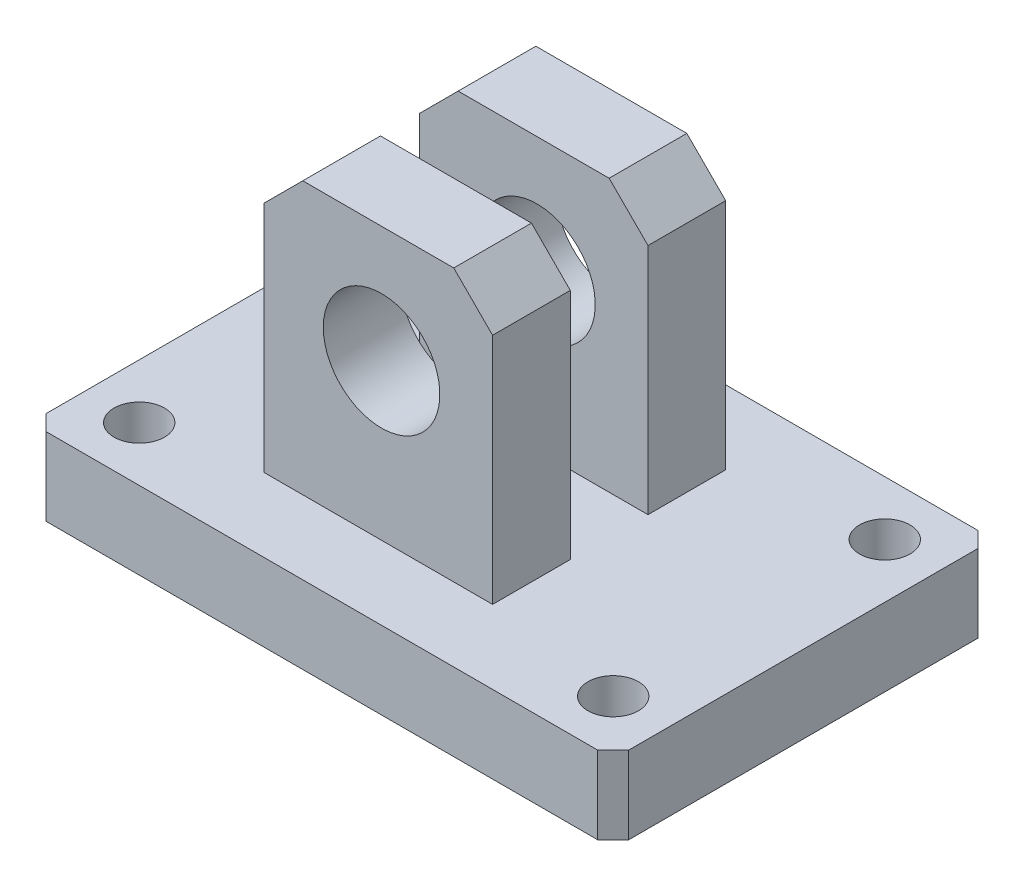
ISO-10303-21;
HEADER;
FILE_DESCRIPTION(('STEP AP214'),'2;1');
FILE_NAME('part.step','',(''),(''),'','','');
FILE_SCHEMA(('AUTOMOTIVE_DESIGN { 1 0 10303 214 1 1 1 1 }'));
ENDSEC;
DATA;
#1=APPLICATION_CONTEXT('core data for automotive mechanical design processes');
#2=APPLICATION_PROTOCOL_DEFINITION('international standard','automotive_design',2000,#1);
#3=PRODUCT_CONTEXT('',#1,'mechanical');
#4=PRODUCT('Part','Part','',(#3));
#5=PRODUCT_RELATED_PRODUCT_CATEGORY('part','',(#4));
#6=PRODUCT_DEFINITION_FORMATION('','',#4);
#7=PRODUCT_DEFINITION_CONTEXT('part definition',#1,'design');
#8=PRODUCT_DEFINITION('design','',#6,#7);
#9=PRODUCT_DEFINITION_SHAPE('','',#8);
#10=(LENGTH_UNIT() NAMED_UNIT(*) SI_UNIT(.MILLI.,.METRE.));
#11=(NAMED_UNIT(*) PLANE_ANGLE_UNIT() SI_UNIT($,.RADIAN.));
#12=(NAMED_UNIT(*) SI_UNIT($,.STERADIAN.) SOLID_ANGLE_UNIT());
#13=UNCERTAINTY_MEASURE_WITH_UNIT(LENGTH_MEASURE(1.E-05),#10,'distance_accuracy_value','');
#14=(GEOMETRIC_REPRESENTATION_CONTEXT(3) GLOBAL_UNCERTAINTY_ASSIGNED_CONTEXT((#13)) GLOBAL_UNIT_ASSIGNED_CONTEXT((#10,
#11,#12)) REPRESENTATION_CONTEXT('',''));
#15=CARTESIAN_POINT('',(0.,0.,0.));
#16=DIRECTION('',(0.,0.,1.));
#17=DIRECTION('',(1.,0.,0.));
#18=AXIS2_PLACEMENT_3D('',#15,#16,#17);
#19=CARTESIAN_POINT('',(0.,10.,0.));
#20=DIRECTION('',(0.,-1.,0.));
#21=DIRECTION('',(0.,0.,-1.));
#22=AXIS2_PLACEMENT_3D('',#19,#20,#21);
#23=PLANE('',#22);
#24=DIRECTION('',(0.,0.,1.));
#25=VECTOR('',#24,1.);
#26=CARTESIAN_POINT('',(-16.9292038909745,10.,-15.));
#27=LINE('',#26,#25);
#28=CARTESIAN_POINT('',(-16.9292038909745,10.,-15.));
#29=VERTEX_POINT('',#28);
#30=CARTESIAN_POINT('',(-16.9292038909745,10.,-5.));
#31=VERTEX_POINT('',#30);
#32=EDGE_CURVE('E228',#29,#31,#27,.T.);
#33=ORIENTED_EDGE('',*,*,#32,.F.);
#34=DIRECTION('',(-1.,0.,0.));
#35=VECTOR('',#34,1.);
#36=CARTESIAN_POINT('',(-16.9292038909745,10.,-15.));
#37=LINE('',#36,#35);
#38=CARTESIAN_POINT('',(12.5027606717748,10.,-15.));
#39=VERTEX_POINT('',#38);
#40=EDGE_CURVE('E234',#39,#29,#37,.T.);
#41=ORIENTED_EDGE('',*,*,#40,.F.);
#42=DIRECTION('',(0.,0.,-1.));
#43=VECTOR('',#42,1.);
#44=CARTESIAN_POINT('',(12.5027606717748,10.,-15.));
#45=LINE('',#44,#43);
#46=CARTESIAN_POINT('',(12.5027606717748,10.,-5.));
#47=VERTEX_POINT('',#46);
#48=EDGE_CURVE('E246',#47,#39,#45,.T.);
#49=ORIENTED_EDGE('',*,*,#48,.F.);
#50=DIRECTION('',(1.,0.,0.));
#51=VECTOR('',#50,1.);
#52=CARTESIAN_POINT('',(-16.9292038909745,10.,-5.));
#53=LINE('',#52,#51);
#54=EDGE_CURVE('E242',#31,#47,#53,.T.);
#55=ORIENTED_EDGE('',*,*,#54,.F.);
#56=EDGE_LOOP('',(#33,#41,#49,#55));
#57=FACE_BOUND('',#56,.T.);
#58=DIRECTION('',(-0.707106781186548,0.,0.707106781186547));
#59=VECTOR('',#58,1.);
#60=CARTESIAN_POINT('',(-37.5,10.,-22.474596659321));
#61=LINE('',#60,#59);
#62=CARTESIAN_POINT('',(-35.5,10.,-24.474596659321));
#63=VERTEX_POINT('',#62);
#64=CARTESIAN_POINT('',(-37.5,10.,-22.474596659321));
#65=VERTEX_POINT('',#64);
#66=EDGE_CURVE('E297',#63,#65,#61,.T.);
#67=ORIENTED_EDGE('',*,*,#66,.T.);
#68=DIRECTION('',(0.,0.,1.));
#69=VECTOR('',#68,1.);
#70=CARTESIAN_POINT('',(-37.5,10.,22.474596659321));
#71=LINE('',#70,#69);
#72=CARTESIAN_POINT('',(-37.5,10.,22.474596659321));
#73=VERTEX_POINT('',#72);
#74=EDGE_CURVE('E301',#65,#73,#71,.T.);
#75=ORIENTED_EDGE('',*,*,#74,.T.);
#76=DIRECTION('',(0.707106781186548,0.,0.707106781186547));
#77=VECTOR('',#76,1.);
#78=CARTESIAN_POINT('',(-37.5,10.,22.474596659321));
#79=LINE('',#78,#77);
#80=CARTESIAN_POINT('',(-35.5,10.,24.474596659321));
#81=VERTEX_POINT('',#80);
#82=EDGE_CURVE('E305',#73,#81,#79,.T.);
#83=ORIENTED_EDGE('',*,*,#82,.T.);
#84=DIRECTION('',(1.,0.,0.));
#85=VECTOR('',#84,1.);
#86=CARTESIAN_POINT('',(-35.5,10.,24.474596659321));
#87=LINE('',#86,#85);
#88=CARTESIAN_POINT('',(35.5,10.,24.474596659321));
#89=VERTEX_POINT('',#88);
#90=EDGE_CURVE('E308',#81,#89,#87,.T.);
#91=ORIENTED_EDGE('',*,*,#90,.T.);
#92=DIRECTION('',(0.707106781186549,0.,-0.707106781186546));
#93=VECTOR('',#92,1.);
#94=CARTESIAN_POINT('',(35.5,10.,24.474596659321));
#95=LINE('',#94,#93);
#96=CARTESIAN_POINT('',(37.5,10.,22.474596659321));
#97=VERTEX_POINT('',#96);
#98=EDGE_CURVE('E311',#89,#97,#95,.T.);
#99=ORIENTED_EDGE('',*,*,#98,.T.);
#100=DIRECTION('',(0.,0.,-1.));
#101=VECTOR('',#100,1.);
#102=CARTESIAN_POINT('',(37.5,10.,-22.474596659321));
#103=LINE('',#102,#101);
#104=CARTESIAN_POINT('',(37.5,10.,-22.474596659321));
#105=VERTEX_POINT('',#104);
#106=EDGE_CURVE('E314',#97,#105,#103,.T.);
#107=ORIENTED_EDGE('',*,*,#106,.T.);
#108=DIRECTION('',(-0.707106781186549,0.,-0.707106781186546));
#109=VECTOR('',#108,1.);
#110=CARTESIAN_POINT('',(35.5,10.,-24.474596659321));
#111=LINE('',#110,#109);
#112=CARTESIAN_POINT('',(35.5,10.,-24.474596659321));
#113=VERTEX_POINT('',#112);
#114=EDGE_CURVE('E317',#105,#113,#111,.T.);
#115=ORIENTED_EDGE('',*,*,#114,.T.);
#116=DIRECTION('',(-1.,0.,0.));
#117=VECTOR('',#116,1.);
#118=CARTESIAN_POINT('',(-35.5,10.,-24.474596659321));
#119=LINE('',#118,#117);
#120=EDGE_CURVE('E320',#113,#63,#119,.T.);
#121=ORIENTED_EDGE('',*,*,#120,.T.);
#122=EDGE_LOOP('',(#67,#75,#83,#91,#99,#107,#115,#121));
#123=FACE_BOUND('',#122,.T.);
#124=CARTESIAN_POINT('',(-30.5,10.,-17.474596659321));
#125=DIRECTION('',(0.,1.,0.));
#126=DIRECTION('',(0.,0.,1.));
#127=AXIS2_PLACEMENT_3D('',#124,#125,#126);
#128=CIRCLE('',#127,3.25);
#129=CARTESIAN_POINT('',(-30.5,10.,-14.224596659321));
#130=VERTEX_POINT('',#129);
#131=EDGE_CURVE('E289',#130,#130,#128,.T.);
#132=ORIENTED_EDGE('',*,*,#131,.F.);
#133=EDGE_LOOP('',(#132));
#134=FACE_BOUND('',#133,.T.);
#135=CARTESIAN_POINT('',(30.5,10.,-17.474596659321));
#136=DIRECTION('',(0.,1.,0.));
#137=DIRECTION('',(0.,0.,1.));
#138=AXIS2_PLACEMENT_3D('',#135,#136,#137);
#139=CIRCLE('',#138,3.25);
#140=CARTESIAN_POINT('',(30.5,10.,-14.224596659321));
#141=VERTEX_POINT('',#140);
#142=EDGE_CURVE('E281',#141,#141,#139,.T.);
#143=ORIENTED_EDGE('',*,*,#142,.F.);
#144=EDGE_LOOP('',(#143));
#145=FACE_BOUND('',#144,.T.);
#146=CARTESIAN_POINT('',(30.5,10.,17.474596659321));
#147=DIRECTION('',(0.,1.,0.));
#148=DIRECTION('',(0.,0.,-1.));
#149=AXIS2_PLACEMENT_3D('',#146,#147,#148);
#150=CIRCLE('',#149,3.25);
#151=CARTESIAN_POINT('',(30.5,10.,14.224596659321));
#152=VERTEX_POINT('',#151);
#153=EDGE_CURVE('E273',#152,#152,#150,.T.);
#154=ORIENTED_EDGE('',*,*,#153,.F.);
#155=EDGE_LOOP('',(#154));
#156=FACE_BOUND('',#155,.T.);
#157=CARTESIAN_POINT('',(-30.5,10.,17.474596659321));
#158=DIRECTION('',(0.,1.,0.));
#159=DIRECTION('',(0.,0.,-1.));
#160=AXIS2_PLACEMENT_3D('',#157,#158,#159);
#161=CIRCLE('',#160,3.25);
#162=CARTESIAN_POINT('',(-30.5,10.,14.224596659321));
#163=VERTEX_POINT('',#162);
#164=EDGE_CURVE('E265',#163,#163,#161,.T.);
#165=ORIENTED_EDGE('',*,*,#164,.F.);
#166=EDGE_LOOP('',(#165));
#167=FACE_BOUND('',#166,.T.);
#168=DIRECTION('',(1.,0.,0.));
#169=VECTOR('',#168,1.);
#170=CARTESIAN_POINT('',(-16.9292038909745,10.,15.));
#171=LINE('',#170,#169);
#172=CARTESIAN_POINT('',(-16.9292038909745,10.,15.));
#173=VERTEX_POINT('',#172);
#174=CARTESIAN_POINT('',(12.5027606717747,10.,15.));
#175=VERTEX_POINT('',#174);
#176=EDGE_CURVE('E187',#173,#175,#171,.T.);
#177=ORIENTED_EDGE('',*,*,#176,.F.);
#178=DIRECTION('',(0.,0.,1.));
#179=VECTOR('',#178,1.);
#180=CARTESIAN_POINT('',(-16.9292038909745,10.,15.));
#181=LINE('',#180,#179);
#182=CARTESIAN_POINT('',(-16.9292038909745,10.,5.));
#183=VERTEX_POINT('',#182);
#184=EDGE_CURVE('E200',#183,#173,#181,.T.);
#185=ORIENTED_EDGE('',*,*,#184,.F.);
#186=DIRECTION('',(-1.,0.,0.));
#187=VECTOR('',#186,1.);
#188=CARTESIAN_POINT('',(-16.9292038909745,10.,5.));
#189=LINE('',#188,#187);
#190=CARTESIAN_POINT('',(12.5027606717747,10.,5.));
#191=VERTEX_POINT('',#190);
#192=EDGE_CURVE('E211',#191,#183,#189,.T.);
#193=ORIENTED_EDGE('',*,*,#192,.F.);
#194=DIRECTION('',(0.,0.,-1.));
#195=VECTOR('',#194,1.);
#196=CARTESIAN_POINT('',(12.5027606717747,10.,15.));
#197=LINE('',#196,#195);
#198=EDGE_CURVE('E203',#175,#191,#197,.T.);
#199=ORIENTED_EDGE('',*,*,#198,.F.);
#200=EDGE_LOOP('',(#177,#185,#193,#199));
#201=FACE_BOUND('',#200,.T.);
#202=ADVANCED_FACE('F43',(#57,#123,#134,#145,#156,#167,#201),#23,.F.);
#203=CARTESIAN_POINT('',(0.,0.,0.));
#204=DIRECTION('',(0.,-1.,0.));
#205=DIRECTION('',(0.,0.,-1.));
#206=AXIS2_PLACEMENT_3D('',#203,#204,#205);
#207=PLANE('',#206);
#208=CARTESIAN_POINT('',(30.5,0.,17.474596659321));
#209=DIRECTION('',(0.,1.,0.));
#210=DIRECTION('',(0.,0.,-1.));
#211=AXIS2_PLACEMENT_3D('',#208,#209,#210);
#212=CIRCLE('',#211,3.25);
#213=CARTESIAN_POINT('',(30.5,0.,14.224596659321));
#214=VERTEX_POINT('',#213);
#215=EDGE_CURVE('E269',#214,#214,#212,.T.);
#216=ORIENTED_EDGE('',*,*,#215,.T.);
#217=EDGE_LOOP('',(#216));
#218=FACE_BOUND('',#217,.T.);
#219=CARTESIAN_POINT('',(-30.5,0.,-17.474596659321));
#220=DIRECTION('',(0.,1.,0.));
#221=DIRECTION('',(0.,0.,1.));
#222=AXIS2_PLACEMENT_3D('',#219,#220,#221);
#223=CIRCLE('',#222,3.25);
#224=CARTESIAN_POINT('',(-30.5,0.,-14.224596659321));
#225=VERTEX_POINT('',#224);
#226=EDGE_CURVE('E285',#225,#225,#223,.T.);
#227=ORIENTED_EDGE('',*,*,#226,.T.);
#228=EDGE_LOOP('',(#227));
#229=FACE_BOUND('',#228,.T.);
#230=DIRECTION('',(-0.707106781186548,0.,0.707106781186547));
#231=VECTOR('',#230,1.);
#232=CARTESIAN_POINT('',(-37.5,0.,-22.474596659321));
#233=LINE('',#232,#231);
#234=CARTESIAN_POINT('',(-35.5,0.,-24.474596659321));
#235=VERTEX_POINT('',#234);
#236=CARTESIAN_POINT('',(-37.5,0.,-22.474596659321));
#237=VERTEX_POINT('',#236);
#238=EDGE_CURVE('E293',#235,#237,#233,.T.);
#239=ORIENTED_EDGE('',*,*,#238,.F.);
#240=DIRECTION('',(-1.,0.,0.));
#241=VECTOR('',#240,1.);
#242=CARTESIAN_POINT('',(-35.5,0.,-24.474596659321));
#243=LINE('',#242,#241);
#244=CARTESIAN_POINT('',(35.5,0.,-24.474596659321));
#245=VERTEX_POINT('',#244);
#246=EDGE_CURVE('E302',#245,#235,#243,.T.);
#247=ORIENTED_EDGE('',*,*,#246,.F.);
#248=DIRECTION('',(-0.707106781186549,0.,-0.707106781186546));
#249=VECTOR('',#248,1.);
#250=CARTESIAN_POINT('',(35.5,0.,-24.474596659321));
#251=LINE('',#250,#249);
#252=CARTESIAN_POINT('',(37.5,0.,-22.474596659321));
#253=VERTEX_POINT('',#252);
#254=EDGE_CURVE('E342',#253,#245,#251,.T.);
#255=ORIENTED_EDGE('',*,*,#254,.F.);
#256=DIRECTION('',(0.,0.,-1.));
#257=VECTOR('',#256,1.);
#258=CARTESIAN_POINT('',(37.5,0.,-22.474596659321));
#259=LINE('',#258,#257);
#260=CARTESIAN_POINT('',(37.5,0.,22.474596659321));
#261=VERTEX_POINT('',#260);
#262=EDGE_CURVE('E339',#261,#253,#259,.T.);
#263=ORIENTED_EDGE('',*,*,#262,.F.);
#264=DIRECTION('',(0.707106781186549,0.,-0.707106781186546));
#265=VECTOR('',#264,1.);
#266=CARTESIAN_POINT('',(35.5,0.,24.474596659321));
#267=LINE('',#266,#265);
#268=CARTESIAN_POINT('',(35.5,0.,24.474596659321));
#269=VERTEX_POINT('',#268);
#270=EDGE_CURVE('E336',#269,#261,#267,.T.);
#271=ORIENTED_EDGE('',*,*,#270,.F.);
#272=DIRECTION('',(1.,0.,0.));
#273=VECTOR('',#272,1.);
#274=CARTESIAN_POINT('',(-35.5,0.,24.474596659321));
#275=LINE('',#274,#273);
#276=CARTESIAN_POINT('',(-35.5,0.,24.474596659321));
#277=VERTEX_POINT('',#276);
#278=EDGE_CURVE('E333',#277,#269,#275,.T.);
#279=ORIENTED_EDGE('',*,*,#278,.F.);
#280=DIRECTION('',(0.707106781186548,0.,0.707106781186547));
#281=VECTOR('',#280,1.);
#282=CARTESIAN_POINT('',(-37.5,0.,22.474596659321));
#283=LINE('',#282,#281);
#284=CARTESIAN_POINT('',(-37.5,0.,22.474596659321));
#285=VERTEX_POINT('',#284);
#286=EDGE_CURVE('E330',#285,#277,#283,.T.);
#287=ORIENTED_EDGE('',*,*,#286,.F.);
#288=DIRECTION('',(0.,0.,1.));
#289=VECTOR('',#288,1.);
#290=CARTESIAN_POINT('',(-37.5,0.,22.474596659321));
#291=LINE('',#290,#289);
#292=EDGE_CURVE('E327',#237,#285,#291,.T.);
#293=ORIENTED_EDGE('',*,*,#292,.F.);
#294=EDGE_LOOP('',(#239,#247,#255,#263,#271,#279,#287,#293));
#295=FACE_BOUND('',#294,.T.);
#296=CARTESIAN_POINT('',(30.5,0.,-17.474596659321));
#297=DIRECTION('',(0.,1.,0.));
#298=DIRECTION('',(0.,0.,1.));
#299=AXIS2_PLACEMENT_3D('',#296,#297,#298);
#300=CIRCLE('',#299,3.25);
#301=CARTESIAN_POINT('',(30.5,0.,-14.224596659321));
#302=VERTEX_POINT('',#301);
#303=EDGE_CURVE('E277',#302,#302,#300,.T.);
#304=ORIENTED_EDGE('',*,*,#303,.T.);
#305=EDGE_LOOP('',(#304));
#306=FACE_BOUND('',#305,.T.);
#307=CARTESIAN_POINT('',(-30.5,0.,17.474596659321));
#308=DIRECTION('',(0.,1.,0.));
#309=DIRECTION('',(0.,0.,-1.));
#310=AXIS2_PLACEMENT_3D('',#307,#308,#309);
#311=CIRCLE('',#310,3.25);
#312=CARTESIAN_POINT('',(-30.5,0.,14.224596659321));
#313=VERTEX_POINT('',#312);
#314=EDGE_CURVE('E264',#313,#313,#311,.T.);
#315=ORIENTED_EDGE('',*,*,#314,.T.);
#316=EDGE_LOOP('',(#315));
#317=FACE_BOUND('',#316,.T.);
#318=ADVANCED_FACE('F457',(#218,#229,#295,#306,#317),#207,.T.);
#319=CARTESIAN_POINT('',(-37.5,10.,-22.474596659321));
#320=DIRECTION('',(0.707106781186547,0.,0.707106781186548));
#321=DIRECTION('',(0.707106781186548,0.,-0.707106781186547));
#322=AXIS2_PLACEMENT_3D('',#319,#320,#321);
#323=PLANE('',#322);
#324=ORIENTED_EDGE('',*,*,#238,.T.);
#325=DIRECTION('',(0.,-1.,0.));
#326=VECTOR('',#325,1.);
#327=CARTESIAN_POINT('',(-37.5,10.,-22.474596659321));
#328=LINE('',#327,#326);
#329=EDGE_CURVE('E374',#65,#237,#328,.T.);
#330=ORIENTED_EDGE('',*,*,#329,.F.);
#331=ORIENTED_EDGE('',*,*,#66,.F.);
#332=DIRECTION('',(0.,-1.,0.));
#333=VECTOR('',#332,1.);
#334=CARTESIAN_POINT('',(-35.5,10.,-24.474596659321));
#335=LINE('',#334,#333);
#336=EDGE_CURVE('E323',#63,#235,#335,.T.);
#337=ORIENTED_EDGE('',*,*,#336,.T.);
#338=EDGE_LOOP('',(#324,#330,#331,#337));
#339=FACE_BOUND('',#338,.T.);
#340=ADVANCED_FACE('F462',(#339),#323,.F.);
#341=CARTESIAN_POINT('',(-37.5,10.,22.474596659321));
#342=DIRECTION('',(1.,0.,0.));
#343=DIRECTION('',(0.,0.,-1.));
#344=AXIS2_PLACEMENT_3D('',#341,#342,#343);
#345=PLANE('',#344);
#346=ORIENTED_EDGE('',*,*,#292,.T.);
#347=DIRECTION('',(0.,-1.,0.));
#348=VECTOR('',#347,1.);
#349=CARTESIAN_POINT('',(-37.5,10.,22.474596659321));
#350=LINE('',#349,#348);
#351=EDGE_CURVE('E370',#73,#285,#350,.T.);
#352=ORIENTED_EDGE('',*,*,#351,.F.);
#353=ORIENTED_EDGE('',*,*,#74,.F.);
#354=ORIENTED_EDGE('',*,*,#329,.T.);
#355=EDGE_LOOP('',(#346,#352,#353,#354));
#356=FACE_BOUND('',#355,.T.);
#357=ADVANCED_FACE('F492',(#356),#345,.F.);
#358=CARTESIAN_POINT('',(-37.5,10.,22.474596659321));
#359=DIRECTION('',(0.707106781186547,0.,-0.707106781186548));
#360=DIRECTION('',(-0.707106781186548,0.,-0.707106781186547));
#361=AXIS2_PLACEMENT_3D('',#358,#359,#360);
#362=PLANE('',#361);
#363=ORIENTED_EDGE('',*,*,#286,.T.);
#364=DIRECTION('',(0.,-1.,0.));
#365=VECTOR('',#364,1.);
#366=CARTESIAN_POINT('',(-35.5,10.,24.474596659321));
#367=LINE('',#366,#365);
#368=EDGE_CURVE('E366',#81,#277,#367,.T.);
#369=ORIENTED_EDGE('',*,*,#368,.F.);
#370=ORIENTED_EDGE('',*,*,#82,.F.);
#371=ORIENTED_EDGE('',*,*,#351,.T.);
#372=EDGE_LOOP('',(#363,#369,#370,#371));
#373=FACE_BOUND('',#372,.T.);
#374=ADVANCED_FACE('F488',(#373),#362,.F.);
#375=CARTESIAN_POINT('',(-35.5,10.,24.474596659321));
#376=DIRECTION('',(0.,0.,-1.));
#377=DIRECTION('',(-1.,0.,0.));
#378=AXIS2_PLACEMENT_3D('',#375,#376,#377);
#379=PLANE('',#378);
#380=ORIENTED_EDGE('',*,*,#278,.T.);
#381=DIRECTION('',(0.,-1.,0.));
#382=VECTOR('',#381,1.);
#383=CARTESIAN_POINT('',(35.5,10.,24.474596659321));
#384=LINE('',#383,#382);
#385=EDGE_CURVE('E362',#89,#269,#384,.T.);
#386=ORIENTED_EDGE('',*,*,#385,.F.);
#387=ORIENTED_EDGE('',*,*,#90,.F.);
#388=ORIENTED_EDGE('',*,*,#368,.T.);
#389=EDGE_LOOP('',(#380,#386,#387,#388));
#390=FACE_BOUND('',#389,.T.);
#391=ADVANCED_FACE('F484',(#390),#379,.F.);
#392=CARTESIAN_POINT('',(35.5,10.,24.474596659321));
#393=DIRECTION('',(-0.707106781186546,0.,-0.707106781186549));
#394=DIRECTION('',(-0.707106781186549,0.,0.707106781186546));
#395=AXIS2_PLACEMENT_3D('',#392,#393,#394);
#396=PLANE('',#395);
#397=ORIENTED_EDGE('',*,*,#270,.T.);
#398=DIRECTION('',(0.,-1.,0.));
#399=VECTOR('',#398,1.);
#400=CARTESIAN_POINT('',(37.5,10.,22.474596659321));
#401=LINE('',#400,#399);
#402=EDGE_CURVE('E358',#97,#261,#401,.T.);
#403=ORIENTED_EDGE('',*,*,#402,.F.);
#404=ORIENTED_EDGE('',*,*,#98,.F.);
#405=ORIENTED_EDGE('',*,*,#385,.T.);
#406=EDGE_LOOP('',(#397,#403,#404,#405));
#407=FACE_BOUND('',#406,.T.);
#408=ADVANCED_FACE('F480',(#407),#396,.F.);
#409=CARTESIAN_POINT('',(37.5,10.,-22.474596659321));
#410=DIRECTION('',(-1.,0.,0.));
#411=DIRECTION('',(0.,0.,1.));
#412=AXIS2_PLACEMENT_3D('',#409,#410,#411);
#413=PLANE('',#412);
#414=ORIENTED_EDGE('',*,*,#262,.T.);
#415=DIRECTION('',(0.,-1.,0.));
#416=VECTOR('',#415,1.);
#417=CARTESIAN_POINT('',(37.5,10.,-22.474596659321));
#418=LINE('',#417,#416);
#419=EDGE_CURVE('E354',#105,#253,#418,.T.);
#420=ORIENTED_EDGE('',*,*,#419,.F.);
#421=ORIENTED_EDGE('',*,*,#106,.F.);
#422=ORIENTED_EDGE('',*,*,#402,.T.);
#423=EDGE_LOOP('',(#414,#420,#421,#422));
#424=FACE_BOUND('',#423,.T.);
#425=ADVANCED_FACE('F476',(#424),#413,.F.);
#426=CARTESIAN_POINT('',(35.5,10.,-24.474596659321));
#427=DIRECTION('',(-0.707106781186546,0.,0.707106781186549));
#428=DIRECTION('',(0.707106781186549,0.,0.707106781186546));
#429=AXIS2_PLACEMENT_3D('',#426,#427,#428);
#430=PLANE('',#429);
#431=ORIENTED_EDGE('',*,*,#254,.T.);
#432=DIRECTION('',(0.,-1.,0.));
#433=VECTOR('',#432,1.);
#434=CARTESIAN_POINT('',(35.5,10.,-24.474596659321));
#435=LINE('',#434,#433);
#436=EDGE_CURVE('E350',#113,#245,#435,.T.);
#437=ORIENTED_EDGE('',*,*,#436,.F.);
#438=ORIENTED_EDGE('',*,*,#114,.F.);
#439=ORIENTED_EDGE('',*,*,#419,.T.);
#440=EDGE_LOOP('',(#431,#437,#438,#439));
#441=FACE_BOUND('',#440,.T.);
#442=ADVANCED_FACE('F472',(#441),#430,.F.);
#443=CARTESIAN_POINT('',(-35.5,10.,-24.474596659321));
#444=DIRECTION('',(0.,0.,1.));
#445=DIRECTION('',(1.,0.,0.));
#446=AXIS2_PLACEMENT_3D('',#443,#444,#445);
#447=PLANE('',#446);
#448=ORIENTED_EDGE('',*,*,#246,.T.);
#449=ORIENTED_EDGE('',*,*,#336,.F.);
#450=ORIENTED_EDGE('',*,*,#120,.F.);
#451=ORIENTED_EDGE('',*,*,#436,.T.);
#452=EDGE_LOOP('',(#448,#449,#450,#451));
#453=FACE_BOUND('',#452,.T.);
#454=ADVANCED_FACE('F469',(#453),#447,.F.);
#455=CARTESIAN_POINT('',(-30.5,10.,-17.474596659321));
#456=DIRECTION('',(0.,-1.,0.));
#457=DIRECTION('',(0.,0.,-1.));
#458=AXIS2_PLACEMENT_3D('',#455,#456,#457);
#459=CYLINDRICAL_SURFACE('',#458,3.25);
#460=ORIENTED_EDGE('',*,*,#131,.T.);
#461=EDGE_LOOP('',(#460));
#462=FACE_BOUND('',#461,.T.);
#463=ORIENTED_EDGE('',*,*,#226,.F.);
#464=EDGE_LOOP('',(#463));
#465=FACE_BOUND('',#464,.T.);
#466=ADVANCED_FACE('F466',(#462,#465),#459,.F.);
#467=CARTESIAN_POINT('',(30.5,10.,-17.474596659321));
#468=DIRECTION('',(0.,-1.,0.));
#469=DIRECTION('',(0.,0.,-1.));
#470=AXIS2_PLACEMENT_3D('',#467,#468,#469);
#471=CYLINDRICAL_SURFACE('',#470,3.25);
#472=ORIENTED_EDGE('',*,*,#142,.T.);
#473=EDGE_LOOP('',(#472));
#474=FACE_BOUND('',#473,.T.);
#475=ORIENTED_EDGE('',*,*,#303,.F.);
#476=EDGE_LOOP('',(#475));
#477=FACE_BOUND('',#476,.T.);
#478=ADVANCED_FACE('F571',(#474,#477),#471,.F.);
#479=CARTESIAN_POINT('',(30.5,10.,17.474596659321));
#480=DIRECTION('',(0.,-1.,0.));
#481=DIRECTION('',(0.,0.,-1.));
#482=AXIS2_PLACEMENT_3D('',#479,#480,#481);
#483=CYLINDRICAL_SURFACE('',#482,3.25);
#484=ORIENTED_EDGE('',*,*,#153,.T.);
#485=EDGE_LOOP('',(#484));
#486=FACE_BOUND('',#485,.T.);
#487=ORIENTED_EDGE('',*,*,#215,.F.);
#488=EDGE_LOOP('',(#487));
#489=FACE_BOUND('',#488,.T.);
#490=ADVANCED_FACE('F568',(#486,#489),#483,.F.);
#491=CARTESIAN_POINT('',(-30.5,10.,17.474596659321));
#492=DIRECTION('',(0.,-1.,0.));
#493=DIRECTION('',(0.,0.,-1.));
#494=AXIS2_PLACEMENT_3D('',#491,#492,#493);
#495=CYLINDRICAL_SURFACE('',#494,3.25);
#496=ORIENTED_EDGE('',*,*,#164,.T.);
#497=EDGE_LOOP('',(#496));
#498=FACE_BOUND('',#497,.T.);
#499=ORIENTED_EDGE('',*,*,#314,.F.);
#500=EDGE_LOOP('',(#499));
#501=FACE_BOUND('',#500,.T.);
#502=ADVANCED_FACE('F565',(#498,#501),#495,.F.);
#503=CARTESIAN_POINT('',(-16.9292038909745,45.,-15.));
#504=DIRECTION('',(1.,0.,0.));
#505=DIRECTION('',(0.,0.,-1.));
#506=AXIS2_PLACEMENT_3D('',#503,#504,#505);
#507=PLANE('',#506);
#508=DIRECTION('',(0.,-1.,0.));
#509=VECTOR('',#508,1.);
#510=CARTESIAN_POINT('',(-16.9292038909745,45.,-5.));
#511=LINE('',#510,#509);
#512=CARTESIAN_POINT('',(-16.9292038909745,40.,-5.));
#513=VERTEX_POINT('',#512);
#514=EDGE_CURVE('E261',#513,#31,#511,.T.);
#515=ORIENTED_EDGE('',*,*,#514,.F.);
#516=DIRECTION('',(0.,0.,-1.));
#517=VECTOR('',#516,1.);
#518=CARTESIAN_POINT('',(-16.9292038909745,40.,-15.));
#519=LINE('',#518,#517);
#520=CARTESIAN_POINT('',(-16.9292038909745,40.,-15.));
#521=VERTEX_POINT('',#520);
#522=EDGE_CURVE('E68',#513,#521,#519,.T.);
#523=ORIENTED_EDGE('',*,*,#522,.T.);
#524=DIRECTION('',(0.,-1.,0.));
#525=VECTOR('',#524,1.);
#526=CARTESIAN_POINT('',(-16.9292038909745,45.,-15.));
#527=LINE('',#526,#525);
#528=EDGE_CURVE('E238',#521,#29,#527,.T.);
#529=ORIENTED_EDGE('',*,*,#528,.T.);
#530=ORIENTED_EDGE('',*,*,#32,.T.);
#531=EDGE_LOOP('',(#515,#523,#529,#530));
#532=FACE_BOUND('',#531,.T.);
#533=ADVANCED_FACE('F439',(#532),#507,.F.);
#534=CARTESIAN_POINT('',(-16.9292038909745,45.,-5.));
#535=DIRECTION('',(0.,0.,-1.));
#536=DIRECTION('',(-1.,0.,0.));
#537=AXIS2_PLACEMENT_3D('',#534,#535,#536);
#538=PLANE('',#537);
#539=CARTESIAN_POINT('',(-1.7861086673964,30.,-5.));
#540=DIRECTION('',(0.,0.,-1.));
#541=DIRECTION('',(-1.,0.,0.));
#542=AXIS2_PLACEMENT_3D('',#539,#540,#541);
#543=CIRCLE('',#542,7.5);
#544=CARTESIAN_POINT('',(-9.2861086673964,30.,-5.));
#545=VERTEX_POINT('',#544);
#546=EDGE_CURVE('E205',#545,#545,#543,.T.);
#547=ORIENTED_EDGE('',*,*,#546,.T.);
#548=EDGE_LOOP('',(#547));
#549=FACE_BOUND('',#548,.T.);
#550=DIRECTION('',(1.,0.,0.));
#551=VECTOR('',#550,1.);
#552=CARTESIAN_POINT('',(-16.9292038909745,45.,-5.));
#553=LINE('',#552,#551);
#554=CARTESIAN_POINT('',(-11.9292038909745,45.,-5.));
#555=VERTEX_POINT('',#554);
#556=CARTESIAN_POINT('',(7.50276067177476,45.,-5.));
#557=VERTEX_POINT('',#556);
#558=EDGE_CURVE('E229',#555,#557,#553,.T.);
#559=ORIENTED_EDGE('',*,*,#558,.F.);
#560=DIRECTION('',(-0.707106781186549,-0.707106781186547,0.));
#561=VECTOR('',#560,1.);
#562=CARTESIAN_POINT('',(-11.9292038909745,45.,-5.));
#563=LINE('',#562,#561);
#564=EDGE_CURVE('E420',#555,#513,#563,.T.);
#565=ORIENTED_EDGE('',*,*,#564,.T.);
#566=ORIENTED_EDGE('',*,*,#514,.T.);
#567=ORIENTED_EDGE('',*,*,#54,.T.);
#568=DIRECTION('',(0.,-1.,0.));
#569=VECTOR('',#568,1.);
#570=CARTESIAN_POINT('',(12.5027606717748,45.,-5.));
#571=LINE('',#570,#569);
#572=CARTESIAN_POINT('',(12.5027606717748,40.,-5.));
#573=VERTEX_POINT('',#572);
#574=EDGE_CURVE('E258',#573,#47,#571,.T.);
#575=ORIENTED_EDGE('',*,*,#574,.F.);
#576=DIRECTION('',(-0.707106781186549,0.707106781186547,0.));
#577=VECTOR('',#576,1.);
#578=CARTESIAN_POINT('',(7.50276067177476,45.,-5.));
#579=LINE('',#578,#577);
#580=EDGE_CURVE('E417',#573,#557,#579,.T.);
#581=ORIENTED_EDGE('',*,*,#580,.T.);
#582=EDGE_LOOP('',(#559,#565,#566,#567,#575,#581));
#583=FACE_BOUND('',#582,.T.);
#584=ADVANCED_FACE('F437',(#549,#583),#538,.F.);
#585=CARTESIAN_POINT('',(12.5027606717748,45.,-15.));
#586=DIRECTION('',(-1.,0.,0.));
#587=DIRECTION('',(0.,0.,1.));
#588=AXIS2_PLACEMENT_3D('',#585,#586,#587);
#589=PLANE('',#588);
#590=DIRECTION('',(0.,-1.,0.));
#591=VECTOR('',#590,1.);
#592=CARTESIAN_POINT('',(12.5027606717748,45.,-15.));
#593=LINE('',#592,#591);
#594=CARTESIAN_POINT('',(12.5027606717748,40.,-15.));
#595=VERTEX_POINT('',#594);
#596=EDGE_CURVE('E255',#595,#39,#593,.T.);
#597=ORIENTED_EDGE('',*,*,#596,.F.);
#598=DIRECTION('',(0.,0.,1.));
#599=VECTOR('',#598,1.);
#600=CARTESIAN_POINT('',(12.5027606717748,40.,-5.));
#601=LINE('',#600,#599);
#602=EDGE_CURVE('E11',#595,#573,#601,.T.);
#603=ORIENTED_EDGE('',*,*,#602,.T.);
#604=ORIENTED_EDGE('',*,*,#574,.T.);
#605=ORIENTED_EDGE('',*,*,#48,.T.);
#606=EDGE_LOOP('',(#597,#603,#604,#605));
#607=FACE_BOUND('',#606,.T.);
#608=ADVANCED_FACE('F447',(#607),#589,.F.);
#609=CARTESIAN_POINT('',(-16.9292038909745,45.,-15.));
#610=DIRECTION('',(0.,0.,1.));
#611=DIRECTION('',(1.,0.,0.));
#612=AXIS2_PLACEMENT_3D('',#609,#610,#611);
#613=PLANE('',#612);
#614=CARTESIAN_POINT('',(-1.7861086673964,30.,-15.));
#615=DIRECTION('',(0.,0.,-1.));
#616=DIRECTION('',(-1.,0.,0.));
#617=AXIS2_PLACEMENT_3D('',#614,#615,#616);
#618=CIRCLE('',#617,7.5);
#619=CARTESIAN_POINT('',(-9.2861086673964,30.,-15.));
#620=VERTEX_POINT('',#619);
#621=EDGE_CURVE('E384',#620,#620,#618,.T.);
#622=ORIENTED_EDGE('',*,*,#621,.F.);
#623=EDGE_LOOP('',(#622));
#624=FACE_BOUND('',#623,.T.);
#625=ORIENTED_EDGE('',*,*,#528,.F.);
#626=DIRECTION('',(0.707106781186549,0.707106781186547,0.));
#627=VECTOR('',#626,1.);
#628=CARTESIAN_POINT('',(-11.9292038909745,45.,-15.));
#629=LINE('',#628,#627);
#630=CARTESIAN_POINT('',(-11.9292038909745,45.,-15.));
#631=VERTEX_POINT('',#630);
#632=EDGE_CURVE('E53',#521,#631,#629,.T.);
#633=ORIENTED_EDGE('',*,*,#632,.T.);
#634=DIRECTION('',(-1.,0.,0.));
#635=VECTOR('',#634,1.);
#636=CARTESIAN_POINT('',(-16.9292038909745,45.,-15.));
#637=LINE('',#636,#635);
#638=CARTESIAN_POINT('',(7.50276067177475,45.,-15.));
#639=VERTEX_POINT('',#638);
#640=EDGE_CURVE('E233',#639,#631,#637,.T.);
#641=ORIENTED_EDGE('',*,*,#640,.F.);
#642=DIRECTION('',(0.707106781186549,-0.707106781186547,0.));
#643=VECTOR('',#642,1.);
#644=CARTESIAN_POINT('',(7.50276067177476,45.,-15.));
#645=LINE('',#644,#643);
#646=EDGE_CURVE('E60',#639,#595,#645,.T.);
#647=ORIENTED_EDGE('',*,*,#646,.T.);
#648=ORIENTED_EDGE('',*,*,#596,.T.);
#649=ORIENTED_EDGE('',*,*,#40,.T.);
#650=EDGE_LOOP('',(#625,#633,#641,#647,#648,#649));
#651=FACE_BOUND('',#650,.T.);
#652=ADVANCED_FACE('F428',(#624,#651),#613,.F.);
#653=CARTESIAN_POINT('',(0.,45.,0.));
#654=DIRECTION('',(0.,1.,0.));
#655=DIRECTION('',(0.,0.,1.));
#656=AXIS2_PLACEMENT_3D('',#653,#654,#655);
#657=PLANE('',#656);
#658=ORIENTED_EDGE('',*,*,#640,.T.);
#659=DIRECTION('',(0.,0.,1.));
#660=VECTOR('',#659,1.);
#661=CARTESIAN_POINT('',(-11.9292038909745,45.,-5.));
#662=LINE('',#661,#660);
#663=EDGE_CURVE('E413',#631,#555,#662,.T.);
#664=ORIENTED_EDGE('',*,*,#663,.T.);
#665=ORIENTED_EDGE('',*,*,#558,.T.);
#666=DIRECTION('',(0.,0.,-1.));
#667=VECTOR('',#666,1.);
#668=CARTESIAN_POINT('',(7.50276067177475,45.,-15.));
#669=LINE('',#668,#667);
#670=EDGE_CURVE('E409',#557,#639,#669,.T.);
#671=ORIENTED_EDGE('',*,*,#670,.T.);
#672=EDGE_LOOP('',(#658,#664,#665,#671));
#673=FACE_BOUND('',#672,.T.);
#674=ADVANCED_FACE('F432',(#673),#657,.T.);
#675=CARTESIAN_POINT('',(-16.9292038909745,45.,15.));
#676=DIRECTION('',(0.,0.,-1.));
#677=DIRECTION('',(-1.,0.,0.));
#678=AXIS2_PLACEMENT_3D('',#675,#676,#677);
#679=PLANE('',#678);
#680=CARTESIAN_POINT('',(-1.7861086673964,30.,15.));
#681=DIRECTION('',(0.,0.,-1.));
#682=DIRECTION('',(-1.,0.,0.));
#683=AXIS2_PLACEMENT_3D('',#680,#681,#682);
#684=CIRCLE('',#683,7.5);
#685=CARTESIAN_POINT('',(-9.2861086673964,30.,15.));
#686=VERTEX_POINT('',#685);
#687=EDGE_CURVE('E383',#686,#686,#684,.T.);
#688=ORIENTED_EDGE('',*,*,#687,.T.);
#689=EDGE_LOOP('',(#688));
#690=FACE_BOUND('',#689,.T.);
#691=DIRECTION('',(1.,0.,0.));
#692=VECTOR('',#691,1.);
#693=CARTESIAN_POINT('',(-16.9292038909745,45.,15.));
#694=LINE('',#693,#692);
#695=CARTESIAN_POINT('',(-11.9292038909745,45.,15.));
#696=VERTEX_POINT('',#695);
#697=CARTESIAN_POINT('',(7.50276067177473,45.,15.));
#698=VERTEX_POINT('',#697);
#699=EDGE_CURVE('E210',#696,#698,#694,.T.);
#700=ORIENTED_EDGE('',*,*,#699,.F.);
#701=DIRECTION('',(-0.707106781186549,-0.707106781186547,0.));
#702=VECTOR('',#701,1.);
#703=CARTESIAN_POINT('',(-11.9292038909745,45.,15.));
#704=LINE('',#703,#702);
#705=CARTESIAN_POINT('',(-16.9292038909745,40.,15.));
#706=VERTEX_POINT('',#705);
#707=EDGE_CURVE('E188',#696,#706,#704,.T.);
#708=ORIENTED_EDGE('',*,*,#707,.T.);
#709=DIRECTION('',(0.,-1.,0.));
#710=VECTOR('',#709,1.);
#711=CARTESIAN_POINT('',(-16.9292038909745,45.,15.));
#712=LINE('',#711,#710);
#713=EDGE_CURVE('E182',#706,#173,#712,.T.);
#714=ORIENTED_EDGE('',*,*,#713,.T.);
#715=ORIENTED_EDGE('',*,*,#176,.T.);
#716=DIRECTION('',(0.,-1.,0.));
#717=VECTOR('',#716,1.);
#718=CARTESIAN_POINT('',(12.5027606717747,45.,15.));
#719=LINE('',#718,#717);
#720=CARTESIAN_POINT('',(12.5027606717747,40.,15.));
#721=VERTEX_POINT('',#720);
#722=EDGE_CURVE('E225',#721,#175,#719,.T.);
#723=ORIENTED_EDGE('',*,*,#722,.F.);
#724=DIRECTION('',(-0.707106781186549,0.707106781186547,0.));
#725=VECTOR('',#724,1.);
#726=CARTESIAN_POINT('',(7.50276067177473,45.,15.));
#727=LINE('',#726,#725);
#728=EDGE_CURVE('E392',#721,#698,#727,.T.);
#729=ORIENTED_EDGE('',*,*,#728,.T.);
#730=EDGE_LOOP('',(#700,#708,#714,#715,#723,#729));
#731=FACE_BOUND('',#730,.T.);
#732=ADVANCED_FACE('F185',(#690,#731),#679,.F.);
#733=CARTESIAN_POINT('',(12.5027606717747,45.,15.));
#734=DIRECTION('',(-1.,0.,0.));
#735=DIRECTION('',(0.,0.,1.));
#736=AXIS2_PLACEMENT_3D('',#733,#734,#735);
#737=PLANE('',#736);
#738=DIRECTION('',(0.,-1.,0.));
#739=VECTOR('',#738,1.);
#740=CARTESIAN_POINT('',(12.5027606717747,45.,5.));
#741=LINE('',#740,#739);
#742=CARTESIAN_POINT('',(12.5027606717747,40.,5.));
#743=VERTEX_POINT('',#742);
#744=EDGE_CURVE('E222',#743,#191,#741,.T.);
#745=ORIENTED_EDGE('',*,*,#744,.F.);
#746=DIRECTION('',(0.,0.,1.));
#747=VECTOR('',#746,1.);
#748=CARTESIAN_POINT('',(12.5027606717747,40.,15.));
#749=LINE('',#748,#747);
#750=EDGE_CURVE('E406',#743,#721,#749,.T.);
#751=ORIENTED_EDGE('',*,*,#750,.T.);
#752=ORIENTED_EDGE('',*,*,#722,.T.);
#753=ORIENTED_EDGE('',*,*,#198,.T.);
#754=EDGE_LOOP('',(#745,#751,#752,#753));
#755=FACE_BOUND('',#754,.T.);
#756=ADVANCED_FACE('F533',(#755),#737,.F.);
#757=CARTESIAN_POINT('',(-16.9292038909745,45.,5.));
#758=DIRECTION('',(0.,0.,1.));
#759=DIRECTION('',(1.,0.,0.));
#760=AXIS2_PLACEMENT_3D('',#757,#758,#759);
#761=PLANE('',#760);
#762=CARTESIAN_POINT('',(-1.7861086673964,30.,5.));
#763=DIRECTION('',(0.,0.,1.));
#764=DIRECTION('',(1.,0.,0.));
#765=AXIS2_PLACEMENT_3D('',#762,#763,#764);
#766=CIRCLE('',#765,7.5);
#767=CARTESIAN_POINT('',(5.7138913326036,30.,5.));
#768=VERTEX_POINT('',#767);
#769=EDGE_CURVE('E379',#768,#768,#766,.T.);
#770=ORIENTED_EDGE('',*,*,#769,.T.);
#771=EDGE_LOOP('',(#770));
#772=FACE_BOUND('',#771,.T.);
#773=DIRECTION('',(0.,-1.,0.));
#774=VECTOR('',#773,1.);
#775=CARTESIAN_POINT('',(-16.9292038909745,45.,5.));
#776=LINE('',#775,#774);
#777=CARTESIAN_POINT('',(-16.9292038909745,40.,5.));
#778=VERTEX_POINT('',#777);
#779=EDGE_CURVE('E193',#778,#183,#776,.T.);
#780=ORIENTED_EDGE('',*,*,#779,.F.);
#781=DIRECTION('',(0.707106781186549,0.707106781186547,0.));
#782=VECTOR('',#781,1.);
#783=CARTESIAN_POINT('',(-11.9292038909745,45.,5.));
#784=LINE('',#783,#782);
#785=CARTESIAN_POINT('',(-11.9292038909745,45.,5.));
#786=VERTEX_POINT('',#785);
#787=EDGE_CURVE('E403',#778,#786,#784,.T.);
#788=ORIENTED_EDGE('',*,*,#787,.T.);
#789=DIRECTION('',(-1.,0.,0.));
#790=VECTOR('',#789,1.);
#791=CARTESIAN_POINT('',(-16.9292038909745,45.,5.));
#792=LINE('',#791,#790);
#793=CARTESIAN_POINT('',(7.50276067177473,45.,5.));
#794=VERTEX_POINT('',#793);
#795=EDGE_CURVE('E194',#794,#786,#792,.T.);
#796=ORIENTED_EDGE('',*,*,#795,.F.);
#797=DIRECTION('',(0.707106781186549,-0.707106781186547,0.));
#798=VECTOR('',#797,1.);
#799=CARTESIAN_POINT('',(7.50276067177473,45.,5.));
#800=LINE('',#799,#798);
#801=EDGE_CURVE('E400',#794,#743,#800,.T.);
#802=ORIENTED_EDGE('',*,*,#801,.T.);
#803=ORIENTED_EDGE('',*,*,#744,.T.);
#804=ORIENTED_EDGE('',*,*,#192,.T.);
#805=EDGE_LOOP('',(#780,#788,#796,#802,#803,#804));
#806=FACE_BOUND('',#805,.T.);
#807=ADVANCED_FACE('F530',(#772,#806),#761,.F.);
#808=CARTESIAN_POINT('',(-16.9292038909745,45.,15.));
#809=DIRECTION('',(1.,0.,0.));
#810=DIRECTION('',(0.,0.,-1.));
#811=AXIS2_PLACEMENT_3D('',#808,#809,#810);
#812=PLANE('',#811);
#813=ORIENTED_EDGE('',*,*,#713,.F.);
#814=DIRECTION('',(0.,0.,-1.));
#815=VECTOR('',#814,1.);
#816=CARTESIAN_POINT('',(-16.9292038909745,40.,5.));
#817=LINE('',#816,#815);
#818=EDGE_CURVE('E397',#706,#778,#817,.T.);
#819=ORIENTED_EDGE('',*,*,#818,.T.);
#820=ORIENTED_EDGE('',*,*,#779,.T.);
#821=ORIENTED_EDGE('',*,*,#184,.T.);
#822=EDGE_LOOP('',(#813,#819,#820,#821));
#823=FACE_BOUND('',#822,.T.);
#824=ADVANCED_FACE('F207',(#823),#812,.F.);
#825=CARTESIAN_POINT('',(0.,45.,0.));
#826=DIRECTION('',(0.,1.,0.));
#827=DIRECTION('',(0.,0.,1.));
#828=AXIS2_PLACEMENT_3D('',#825,#826,#827);
#829=PLANE('',#828);
#830=ORIENTED_EDGE('',*,*,#795,.T.);
#831=DIRECTION('',(0.,0.,1.));
#832=VECTOR('',#831,1.);
#833=CARTESIAN_POINT('',(-11.9292038909745,45.,15.));
#834=LINE('',#833,#832);
#835=EDGE_CURVE('E388',#786,#696,#834,.T.);
#836=ORIENTED_EDGE('',*,*,#835,.T.);
#837=ORIENTED_EDGE('',*,*,#699,.T.);
#838=DIRECTION('',(0.,0.,-1.));
#839=VECTOR('',#838,1.);
#840=CARTESIAN_POINT('',(7.50276067177473,45.,5.));
#841=LINE('',#840,#839);
#842=EDGE_CURVE('E378',#698,#794,#841,.T.);
#843=ORIENTED_EDGE('',*,*,#842,.T.);
#844=EDGE_LOOP('',(#830,#836,#837,#843));
#845=FACE_BOUND('',#844,.T.);
#846=ADVANCED_FACE('F525',(#845),#829,.T.);
#847=CARTESIAN_POINT('',(-1.7861086673964,30.,20.));
#848=DIRECTION('',(0.,0.,-1.));
#849=DIRECTION('',(-1.,0.,0.));
#850=AXIS2_PLACEMENT_3D('',#847,#848,#849);
#851=CYLINDRICAL_SURFACE('',#850,7.5);
#852=ORIENTED_EDGE('',*,*,#769,.F.);
#853=EDGE_LOOP('',(#852));
#854=FACE_BOUND('',#853,.T.);
#855=ORIENTED_EDGE('',*,*,#687,.F.);
#856=EDGE_LOOP('',(#855));
#857=FACE_BOUND('',#856,.T.);
#858=ADVANCED_FACE('F760',(#854,#857),#851,.F.);
#859=ORIENTED_EDGE('',*,*,#621,.T.);
#860=EDGE_LOOP('',(#859));
#861=FACE_BOUND('',#860,.T.);
#862=ORIENTED_EDGE('',*,*,#546,.F.);
#863=EDGE_LOOP('',(#862));
#864=FACE_BOUND('',#863,.T.);
#865=ADVANCED_FACE('F507',(#861,#864),#851,.F.);
#866=CARTESIAN_POINT('',(-11.9292038909745,45.,0.));
#867=DIRECTION('',(-0.707106781186546,0.707106781186548,0.));
#868=DIRECTION('',(0.,0.,-1.));
#869=AXIS2_PLACEMENT_3D('',#866,#867,#868);
#870=PLANE('',#869);
#871=ORIENTED_EDGE('',*,*,#787,.F.);
#872=ORIENTED_EDGE('',*,*,#818,.F.);
#873=ORIENTED_EDGE('',*,*,#707,.F.);
#874=ORIENTED_EDGE('',*,*,#835,.F.);
#875=EDGE_LOOP('',(#871,#872,#873,#874));
#876=FACE_BOUND('',#875,.T.);
#877=ADVANCED_FACE('F501',(#876),#870,.T.);
#878=CARTESIAN_POINT('',(7.50276067177473,45.,0.));
#879=DIRECTION('',(0.707106781186546,0.707106781186548,0.));
#880=DIRECTION('',(0.,0.,1.));
#881=AXIS2_PLACEMENT_3D('',#878,#879,#880);
#882=PLANE('',#881);
#883=ORIENTED_EDGE('',*,*,#728,.F.);
#884=ORIENTED_EDGE('',*,*,#750,.F.);
#885=ORIENTED_EDGE('',*,*,#801,.F.);
#886=ORIENTED_EDGE('',*,*,#842,.F.);
#887=EDGE_LOOP('',(#883,#884,#885,#886));
#888=FACE_BOUND('',#887,.T.);
#889=ADVANCED_FACE('F455',(#888),#882,.T.);
#890=CARTESIAN_POINT('',(-11.9292038909745,45.,0.));
#891=DIRECTION('',(-0.707106781186547,0.707106781186549,0.));
#892=DIRECTION('',(0.,0.,-1.));
#893=AXIS2_PLACEMENT_3D('',#890,#891,#892);
#894=PLANE('',#893);
#895=ORIENTED_EDGE('',*,*,#632,.F.);
#896=ORIENTED_EDGE('',*,*,#522,.F.);
#897=ORIENTED_EDGE('',*,*,#564,.F.);
#898=ORIENTED_EDGE('',*,*,#663,.F.);
#899=EDGE_LOOP('',(#895,#896,#897,#898));
#900=FACE_BOUND('',#899,.T.);
#901=ADVANCED_FACE('F435',(#900),#894,.T.);
#902=CARTESIAN_POINT('',(7.50276067177476,45.,0.));
#903=DIRECTION('',(0.707106781186546,0.707106781186548,0.));
#904=DIRECTION('',(0.,0.,1.));
#905=AXIS2_PLACEMENT_3D('',#902,#903,#904);
#906=PLANE('',#905);
#907=ORIENTED_EDGE('',*,*,#580,.F.);
#908=ORIENTED_EDGE('',*,*,#602,.F.);
#909=ORIENTED_EDGE('',*,*,#646,.F.);
#910=ORIENTED_EDGE('',*,*,#670,.F.);
#911=EDGE_LOOP('',(#907,#908,#909,#910));
#912=FACE_BOUND('',#911,.T.);
#913=ADVANCED_FACE('F46',(#912),#906,.T.);
#914=CLOSED_SHELL('',(#202,#318,#340,#357,#374,#391,#408,#425,#442,#454,#466,#478,#490,#502,
#533,#584,#608,#652,#674,#732,#756,#807,#824,#846,#858,#865,#877,#889,#901,#913));
#915=MANIFOLD_SOLID_BREP('B2',#914);
#916=ADVANCED_BREP_SHAPE_REPRESENTATION('',(#18,#915),#14);
#917=SHAPE_DEFINITION_REPRESENTATION(#9,#916);
ENDSEC;
END-ISO-10303-21;
